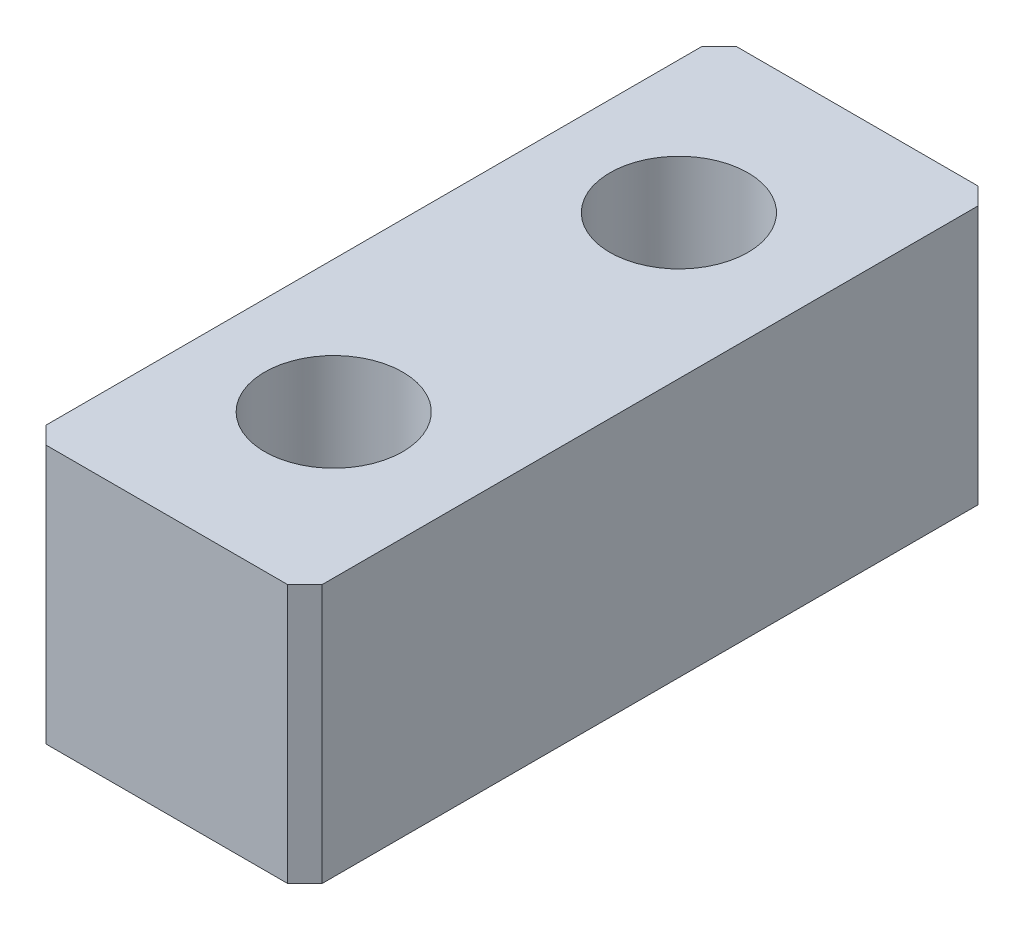
ISO-10303-21;
HEADER;
FILE_DESCRIPTION(('STEP AP214'),'2;1');
FILE_NAME('part.step','',(''),(''),'','','');
FILE_SCHEMA(('AUTOMOTIVE_DESIGN { 1 0 10303 214 1 1 1 1 }'));
ENDSEC;
DATA;
#1=APPLICATION_CONTEXT('core data for automotive mechanical design processes');
#2=APPLICATION_PROTOCOL_DEFINITION('international standard','automotive_design',2000,#1);
#3=PRODUCT_CONTEXT('',#1,'mechanical');
#4=PRODUCT('Part','Part','',(#3));
#5=PRODUCT_RELATED_PRODUCT_CATEGORY('part','',(#4));
#6=PRODUCT_DEFINITION_FORMATION('','',#4);
#7=PRODUCT_DEFINITION_CONTEXT('part definition',#1,'design');
#8=PRODUCT_DEFINITION('design','',#6,#7);
#9=PRODUCT_DEFINITION_SHAPE('','',#8);
#10=(LENGTH_UNIT() NAMED_UNIT(*) SI_UNIT(.MILLI.,.METRE.));
#11=(NAMED_UNIT(*) PLANE_ANGLE_UNIT() SI_UNIT($,.RADIAN.));
#12=(NAMED_UNIT(*) SI_UNIT($,.STERADIAN.) SOLID_ANGLE_UNIT());
#13=UNCERTAINTY_MEASURE_WITH_UNIT(LENGTH_MEASURE(1.E-05),#10,'distance_accuracy_value','');
#14=(GEOMETRIC_REPRESENTATION_CONTEXT(3) GLOBAL_UNCERTAINTY_ASSIGNED_CONTEXT((#13)) GLOBAL_UNIT_ASSIGNED_CONTEXT((#10,
#11,#12)) REPRESENTATION_CONTEXT('',''));
#15=CARTESIAN_POINT('',(0.,0.,0.));
#16=DIRECTION('',(0.,0.,1.));
#17=DIRECTION('',(1.,0.,0.));
#18=AXIS2_PLACEMENT_3D('',#15,#16,#17);
#19=CARTESIAN_POINT('',(-4.,3.75,10.));
#20=DIRECTION('',(1.,0.,0.));
#21=DIRECTION('',(0.,0.,-1.));
#22=AXIS2_PLACEMENT_3D('',#19,#20,#21);
#23=PLANE('',#22);
#24=DIRECTION('',(0.,0.,-1.));
#25=VECTOR('',#24,1.);
#26=CARTESIAN_POINT('',(-4.,-3.75,10.));
#27=LINE('',#26,#25);
#28=CARTESIAN_POINT('',(-4.,-3.75,9.5));
#29=VERTEX_POINT('',#28);
#30=CARTESIAN_POINT('',(-4.,-3.75,-9.49999999999999));
#31=VERTEX_POINT('',#30);
#32=EDGE_CURVE('E121',#29,#31,#27,.T.);
#33=ORIENTED_EDGE('',*,*,#32,.F.);
#34=DIRECTION('',(0.,1.,0.));
#35=VECTOR('',#34,1.);
#36=CARTESIAN_POINT('',(-4.,3.75,9.5));
#37=LINE('',#36,#35);
#38=CARTESIAN_POINT('',(-4.,3.75,9.5));
#39=VERTEX_POINT('',#38);
#40=EDGE_CURVE('E107',#29,#39,#37,.T.);
#41=ORIENTED_EDGE('',*,*,#40,.T.);
#42=DIRECTION('',(0.,0.,-1.));
#43=VECTOR('',#42,1.);
#44=CARTESIAN_POINT('',(-4.,3.75,10.));
#45=LINE('',#44,#43);
#46=CARTESIAN_POINT('',(-4.,3.75,-9.49999999999999));
#47=VERTEX_POINT('',#46);
#48=EDGE_CURVE('E128',#39,#47,#45,.T.);
#49=ORIENTED_EDGE('',*,*,#48,.T.);
#50=DIRECTION('',(0.,-1.,0.));
#51=VECTOR('',#50,1.);
#52=CARTESIAN_POINT('',(-4.,-3.75,-9.5));
#53=LINE('',#52,#51);
#54=EDGE_CURVE('E166',#47,#31,#53,.T.);
#55=ORIENTED_EDGE('',*,*,#54,.T.);
#56=EDGE_LOOP('',(#33,#41,#49,#55));
#57=FACE_BOUND('',#56,.T.);
#58=ADVANCED_FACE('F37',(#57),#23,.F.);
#59=CARTESIAN_POINT('',(4.,-3.75,10.));
#60=DIRECTION('',(0.,1.,0.));
#61=DIRECTION('',(-1.,0.,0.));
#62=AXIS2_PLACEMENT_3D('',#59,#60,#61);
#63=PLANE('',#62);
#64=CARTESIAN_POINT('',(-0.165000000000005,-3.75,5.00000000000039));
#65=DIRECTION('',(0.,-1.,0.));
#66=DIRECTION('',(0.,0.,-1.));
#67=AXIS2_PLACEMENT_3D('',#64,#65,#66);
#68=CIRCLE('',#67,2.);
#69=CARTESIAN_POINT('',(-0.165000000000005,-3.75,3.00000000000039));
#70=VERTEX_POINT('',#69);
#71=EDGE_CURVE('E227',#70,#70,#68,.T.);
#72=ORIENTED_EDGE('',*,*,#71,.F.);
#73=EDGE_LOOP('',(#72));
#74=FACE_BOUND('',#73,.T.);
#75=CARTESIAN_POINT('',(-0.165000000000005,-3.75,-4.99999999999961));
#76=DIRECTION('',(0.,-1.,0.));
#77=DIRECTION('',(0.,0.,-1.));
#78=AXIS2_PLACEMENT_3D('',#75,#76,#77);
#79=CIRCLE('',#78,2.);
#80=CARTESIAN_POINT('',(-0.165000000000005,-3.75,-6.99999999999961));
#81=VERTEX_POINT('',#80);
#82=EDGE_CURVE('E134',#81,#81,#79,.T.);
#83=ORIENTED_EDGE('',*,*,#82,.F.);
#84=EDGE_LOOP('',(#83));
#85=FACE_BOUND('',#84,.T.);
#86=DIRECTION('',(0.,0.,-1.));
#87=VECTOR('',#86,1.);
#88=CARTESIAN_POINT('',(4.,-3.75,10.));
#89=LINE('',#88,#87);
#90=CARTESIAN_POINT('',(4.,-3.75,9.5));
#91=VERTEX_POINT('',#90);
#92=CARTESIAN_POINT('',(4.,-3.75,-9.49999999999999));
#93=VERTEX_POINT('',#92);
#94=EDGE_CURVE('E145',#91,#93,#89,.T.);
#95=ORIENTED_EDGE('',*,*,#94,.F.);
#96=DIRECTION('',(0.707106781186545,0.,-0.70710678118655));
#97=VECTOR('',#96,1.);
#98=CARTESIAN_POINT('',(3.5,-3.75,10.));
#99=LINE('',#98,#97);
#100=CARTESIAN_POINT('',(3.5,-3.75,10.));
#101=VERTEX_POINT('',#100);
#102=EDGE_CURVE('E108',#91,#101,#99,.F.);
#103=ORIENTED_EDGE('',*,*,#102,.T.);
#104=DIRECTION('',(1.,0.,0.));
#105=VECTOR('',#104,1.);
#106=CARTESIAN_POINT('',(4.,-3.75,10.));
#107=LINE('',#106,#105);
#108=CARTESIAN_POINT('',(-3.5,-3.75,10.));
#109=VERTEX_POINT('',#108);
#110=EDGE_CURVE('E116',#109,#101,#107,.T.);
#111=ORIENTED_EDGE('',*,*,#110,.F.);
#112=DIRECTION('',(0.707106781186545,0.,0.70710678118655));
#113=VECTOR('',#112,1.);
#114=CARTESIAN_POINT('',(-3.5,-3.75,10.));
#115=LINE('',#114,#113);
#116=EDGE_CURVE('E60',#109,#29,#115,.F.);
#117=ORIENTED_EDGE('',*,*,#116,.T.);
#118=ORIENTED_EDGE('',*,*,#32,.T.);
#119=DIRECTION('',(0.70710678118655,0.,-0.707106781186545));
#120=VECTOR('',#119,1.);
#121=CARTESIAN_POINT('',(-4.,-3.75,-9.5));
#122=LINE('',#121,#120);
#123=CARTESIAN_POINT('',(-3.5,-3.75,-10.));
#124=VERTEX_POINT('',#123);
#125=EDGE_CURVE('E52',#31,#124,#122,.T.);
#126=ORIENTED_EDGE('',*,*,#125,.T.);
#127=DIRECTION('',(1.,0.,0.));
#128=VECTOR('',#127,1.);
#129=CARTESIAN_POINT('',(4.,-3.75,-10.));
#130=LINE('',#129,#128);
#131=CARTESIAN_POINT('',(3.49999999999999,-3.75,-10.));
#132=VERTEX_POINT('',#131);
#133=EDGE_CURVE('E131',#124,#132,#130,.T.);
#134=ORIENTED_EDGE('',*,*,#133,.T.);
#135=DIRECTION('',(0.70710678118655,0.,0.707106781186545));
#136=VECTOR('',#135,1.);
#137=CARTESIAN_POINT('',(4.,-3.75,-9.5));
#138=LINE('',#137,#136);
#139=EDGE_CURVE('E109',#132,#93,#138,.T.);
#140=ORIENTED_EDGE('',*,*,#139,.T.);
#141=EDGE_LOOP('',(#95,#103,#111,#117,#118,#126,#134,#140));
#142=FACE_BOUND('',#141,.T.);
#143=ADVANCED_FACE('F124',(#74,#85,#142),#63,.F.);
#144=CARTESIAN_POINT('',(4.,3.75,10.));
#145=DIRECTION('',(-1.,0.,0.));
#146=DIRECTION('',(0.,0.,1.));
#147=AXIS2_PLACEMENT_3D('',#144,#145,#146);
#148=PLANE('',#147);
#149=DIRECTION('',(0.,0.,-1.));
#150=VECTOR('',#149,1.);
#151=CARTESIAN_POINT('',(4.,3.75,10.));
#152=LINE('',#151,#150);
#153=CARTESIAN_POINT('',(4.,3.75,9.5));
#154=VERTEX_POINT('',#153);
#155=CARTESIAN_POINT('',(4.,3.75,-9.49999999999999));
#156=VERTEX_POINT('',#155);
#157=EDGE_CURVE('E142',#154,#156,#152,.T.);
#158=ORIENTED_EDGE('',*,*,#157,.F.);
#159=DIRECTION('',(0.,-1.,0.));
#160=VECTOR('',#159,1.);
#161=CARTESIAN_POINT('',(4.,3.75,9.5));
#162=LINE('',#161,#160);
#163=EDGE_CURVE('E161',#154,#91,#162,.T.);
#164=ORIENTED_EDGE('',*,*,#163,.T.);
#165=ORIENTED_EDGE('',*,*,#94,.T.);
#166=DIRECTION('',(0.,1.,0.));
#167=VECTOR('',#166,1.);
#168=CARTESIAN_POINT('',(4.,3.75,-9.5));
#169=LINE('',#168,#167);
#170=EDGE_CURVE('E158',#93,#156,#169,.T.);
#171=ORIENTED_EDGE('',*,*,#170,.T.);
#172=EDGE_LOOP('',(#158,#164,#165,#171));
#173=FACE_BOUND('',#172,.T.);
#174=ADVANCED_FACE('F184',(#173),#148,.F.);
#175=CARTESIAN_POINT('',(4.,3.75,10.));
#176=DIRECTION('',(0.,-1.,0.));
#177=DIRECTION('',(1.,0.,0.));
#178=AXIS2_PLACEMENT_3D('',#175,#176,#177);
#179=PLANE('',#178);
#180=CARTESIAN_POINT('',(-0.165000000000005,3.75,5.00000000000039));
#181=DIRECTION('',(0.,-1.,0.));
#182=DIRECTION('',(1.,0.,0.));
#183=AXIS2_PLACEMENT_3D('',#180,#181,#182);
#184=CIRCLE('',#183,2.);
#185=CARTESIAN_POINT('',(1.83499999999999,3.75,5.00000000000039));
#186=VERTEX_POINT('',#185);
#187=EDGE_CURVE('E224',#186,#186,#184,.F.);
#188=ORIENTED_EDGE('',*,*,#187,.F.);
#189=EDGE_LOOP('',(#188));
#190=FACE_BOUND('',#189,.T.);
#191=CARTESIAN_POINT('',(-0.165000000000005,3.75,-4.99999999999961));
#192=DIRECTION('',(0.,-1.,0.));
#193=DIRECTION('',(1.,0.,0.));
#194=AXIS2_PLACEMENT_3D('',#191,#192,#193);
#195=CIRCLE('',#194,2.);
#196=CARTESIAN_POINT('',(1.83499999999999,3.75,-4.99999999999961));
#197=VERTEX_POINT('',#196);
#198=EDGE_CURVE('E138',#197,#197,#195,.F.);
#199=ORIENTED_EDGE('',*,*,#198,.F.);
#200=EDGE_LOOP('',(#199));
#201=FACE_BOUND('',#200,.T.);
#202=DIRECTION('',(-1.,0.,0.));
#203=VECTOR('',#202,1.);
#204=CARTESIAN_POINT('',(4.,3.75,10.));
#205=LINE('',#204,#203);
#206=CARTESIAN_POINT('',(3.5,3.75,10.));
#207=VERTEX_POINT('',#206);
#208=CARTESIAN_POINT('',(-3.5,3.75,10.));
#209=VERTEX_POINT('',#208);
#210=EDGE_CURVE('E119',#207,#209,#205,.T.);
#211=ORIENTED_EDGE('',*,*,#210,.F.);
#212=DIRECTION('',(-0.707106781186545,0.,0.70710678118655));
#213=VECTOR('',#212,1.);
#214=CARTESIAN_POINT('',(3.5,3.75,10.));
#215=LINE('',#214,#213);
#216=EDGE_CURVE('E156',#207,#154,#215,.F.);
#217=ORIENTED_EDGE('',*,*,#216,.T.);
#218=ORIENTED_EDGE('',*,*,#157,.T.);
#219=DIRECTION('',(-0.70710678118655,0.,-0.707106781186545));
#220=VECTOR('',#219,1.);
#221=CARTESIAN_POINT('',(4.,3.75,-9.5));
#222=LINE('',#221,#220);
#223=CARTESIAN_POINT('',(3.49999999999999,3.75,-10.));
#224=VERTEX_POINT('',#223);
#225=EDGE_CURVE('E152',#156,#224,#222,.T.);
#226=ORIENTED_EDGE('',*,*,#225,.T.);
#227=DIRECTION('',(-1.,0.,0.));
#228=VECTOR('',#227,1.);
#229=CARTESIAN_POINT('',(4.,3.75,-10.));
#230=LINE('',#229,#228);
#231=CARTESIAN_POINT('',(-3.5,3.75,-10.));
#232=VERTEX_POINT('',#231);
#233=EDGE_CURVE('E126',#224,#232,#230,.T.);
#234=ORIENTED_EDGE('',*,*,#233,.T.);
#235=DIRECTION('',(-0.70710678118655,0.,0.707106781186545));
#236=VECTOR('',#235,1.);
#237=CARTESIAN_POINT('',(-4.,3.75,-9.5));
#238=LINE('',#237,#236);
#239=EDGE_CURVE('E150',#232,#47,#238,.T.);
#240=ORIENTED_EDGE('',*,*,#239,.T.);
#241=ORIENTED_EDGE('',*,*,#48,.F.);
#242=DIRECTION('',(-0.707106781186545,0.,-0.70710678118655));
#243=VECTOR('',#242,1.);
#244=CARTESIAN_POINT('',(-3.5,3.75,10.));
#245=LINE('',#244,#243);
#246=EDGE_CURVE('E154',#39,#209,#245,.F.);
#247=ORIENTED_EDGE('',*,*,#246,.T.);
#248=EDGE_LOOP('',(#211,#217,#218,#226,#234,#240,#241,#247));
#249=FACE_BOUND('',#248,.T.);
#250=ADVANCED_FACE('F175',(#190,#201,#249),#179,.F.);
#251=CARTESIAN_POINT('',(0.,0.,10.));
#252=DIRECTION('',(0.,0.,-1.));
#253=DIRECTION('',(-1.,0.,0.));
#254=AXIS2_PLACEMENT_3D('',#251,#252,#253);
#255=PLANE('',#254);
#256=ORIENTED_EDGE('',*,*,#110,.T.);
#257=DIRECTION('',(0.,1.,0.));
#258=VECTOR('',#257,1.);
#259=CARTESIAN_POINT('',(3.5,0.,10.));
#260=LINE('',#259,#258);
#261=EDGE_CURVE('E120',#101,#207,#260,.T.);
#262=ORIENTED_EDGE('',*,*,#261,.T.);
#263=ORIENTED_EDGE('',*,*,#210,.T.);
#264=DIRECTION('',(0.,-1.,0.));
#265=VECTOR('',#264,1.);
#266=CARTESIAN_POINT('',(-3.5,0.,10.));
#267=LINE('',#266,#265);
#268=EDGE_CURVE('E106',#209,#109,#267,.T.);
#269=ORIENTED_EDGE('',*,*,#268,.T.);
#270=EDGE_LOOP('',(#256,#262,#263,#269));
#271=FACE_BOUND('',#270,.T.);
#272=ADVANCED_FACE('F114',(#271),#255,.F.);
#273=CARTESIAN_POINT('',(0.,0.,-10.));
#274=DIRECTION('',(0.,0.,-1.));
#275=DIRECTION('',(-1.,0.,0.));
#276=AXIS2_PLACEMENT_3D('',#273,#274,#275);
#277=PLANE('',#276);
#278=ORIENTED_EDGE('',*,*,#233,.F.);
#279=DIRECTION('',(0.,-1.,0.));
#280=VECTOR('',#279,1.);
#281=CARTESIAN_POINT('',(3.49999999999999,-3.75,-10.));
#282=LINE('',#281,#280);
#283=EDGE_CURVE('E11',#224,#132,#282,.T.);
#284=ORIENTED_EDGE('',*,*,#283,.T.);
#285=ORIENTED_EDGE('',*,*,#133,.F.);
#286=DIRECTION('',(0.,1.,0.));
#287=VECTOR('',#286,1.);
#288=CARTESIAN_POINT('',(-3.5,3.75,-10.));
#289=LINE('',#288,#287);
#290=EDGE_CURVE('E45',#124,#232,#289,.T.);
#291=ORIENTED_EDGE('',*,*,#290,.T.);
#292=EDGE_LOOP('',(#278,#284,#285,#291));
#293=FACE_BOUND('',#292,.T.);
#294=ADVANCED_FACE('F171',(#293),#277,.T.);
#295=CARTESIAN_POINT('',(3.5,0.,10.));
#296=DIRECTION('',(-0.70710678118655,0.,-0.707106781186545));
#297=DIRECTION('',(0.,1.,0.));
#298=AXIS2_PLACEMENT_3D('',#295,#296,#297);
#299=PLANE('',#298);
#300=ORIENTED_EDGE('',*,*,#102,.F.);
#301=ORIENTED_EDGE('',*,*,#163,.F.);
#302=ORIENTED_EDGE('',*,*,#216,.F.);
#303=ORIENTED_EDGE('',*,*,#261,.F.);
#304=EDGE_LOOP('',(#300,#301,#302,#303));
#305=FACE_BOUND('',#304,.T.);
#306=ADVANCED_FACE('F187',(#305),#299,.F.);
#307=CARTESIAN_POINT('',(-3.5,0.,10.));
#308=DIRECTION('',(0.70710678118655,0.,-0.707106781186545));
#309=DIRECTION('',(0.,-1.,0.));
#310=AXIS2_PLACEMENT_3D('',#307,#308,#309);
#311=PLANE('',#310);
#312=ORIENTED_EDGE('',*,*,#246,.F.);
#313=ORIENTED_EDGE('',*,*,#40,.F.);
#314=ORIENTED_EDGE('',*,*,#116,.F.);
#315=ORIENTED_EDGE('',*,*,#268,.F.);
#316=EDGE_LOOP('',(#312,#313,#314,#315));
#317=FACE_BOUND('',#316,.T.);
#318=ADVANCED_FACE('F105',(#317),#311,.F.);
#319=CARTESIAN_POINT('',(4.,3.75,-9.5));
#320=DIRECTION('',(0.707106781186545,0.,-0.70710678118655));
#321=DIRECTION('',(0.,-1.,0.));
#322=AXIS2_PLACEMENT_3D('',#319,#320,#321);
#323=PLANE('',#322);
#324=ORIENTED_EDGE('',*,*,#139,.F.);
#325=ORIENTED_EDGE('',*,*,#283,.F.);
#326=ORIENTED_EDGE('',*,*,#225,.F.);
#327=ORIENTED_EDGE('',*,*,#170,.F.);
#328=EDGE_LOOP('',(#324,#325,#326,#327));
#329=FACE_BOUND('',#328,.T.);
#330=ADVANCED_FACE('F181',(#329),#323,.T.);
#331=CARTESIAN_POINT('',(-4.,3.75,-9.5));
#332=DIRECTION('',(-0.707106781186545,0.,-0.70710678118655));
#333=DIRECTION('',(0.,1.,0.));
#334=AXIS2_PLACEMENT_3D('',#331,#332,#333);
#335=PLANE('',#334);
#336=ORIENTED_EDGE('',*,*,#239,.F.);
#337=ORIENTED_EDGE('',*,*,#290,.F.);
#338=ORIENTED_EDGE('',*,*,#125,.F.);
#339=ORIENTED_EDGE('',*,*,#54,.F.);
#340=EDGE_LOOP('',(#336,#337,#338,#339));
#341=FACE_BOUND('',#340,.T.);
#342=ADVANCED_FACE('F39',(#341),#335,.T.);
#343=CARTESIAN_POINT('',(-0.165000000000005,-3.75,-4.99999999999961));
#344=DIRECTION('',(0.,-1.,0.));
#345=DIRECTION('',(0.,0.,-1.));
#346=AXIS2_PLACEMENT_3D('',#343,#344,#345);
#347=CYLINDRICAL_SURFACE('',#346,2.);
#348=ORIENTED_EDGE('',*,*,#198,.T.);
#349=EDGE_LOOP('',(#348));
#350=FACE_BOUND('',#349,.T.);
#351=ORIENTED_EDGE('',*,*,#82,.T.);
#352=EDGE_LOOP('',(#351));
#353=FACE_BOUND('',#352,.T.);
#354=ADVANCED_FACE('F212',(#350,#353),#347,.F.);
#355=CARTESIAN_POINT('',(-0.165000000000005,-3.75,5.00000000000039));
#356=DIRECTION('',(0.,-1.,0.));
#357=DIRECTION('',(0.,0.,-1.));
#358=AXIS2_PLACEMENT_3D('',#355,#356,#357);
#359=CYLINDRICAL_SURFACE('',#358,2.);
#360=ORIENTED_EDGE('',*,*,#187,.T.);
#361=EDGE_LOOP('',(#360));
#362=FACE_BOUND('',#361,.T.);
#363=ORIENTED_EDGE('',*,*,#71,.T.);
#364=EDGE_LOOP('',(#363));
#365=FACE_BOUND('',#364,.T.);
#366=ADVANCED_FACE('F215',(#362,#365),#359,.F.);
#367=CLOSED_SHELL('',(#58,#143,#174,#250,#272,#294,#306,#318,#330,#342,#354,#366));
#368=MANIFOLD_SOLID_BREP('B2',#367);
#369=ADVANCED_BREP_SHAPE_REPRESENTATION('',(#18,#368),#14);
#370=SHAPE_DEFINITION_REPRESENTATION(#9,#369);
ENDSEC;
END-ISO-10303-21;
